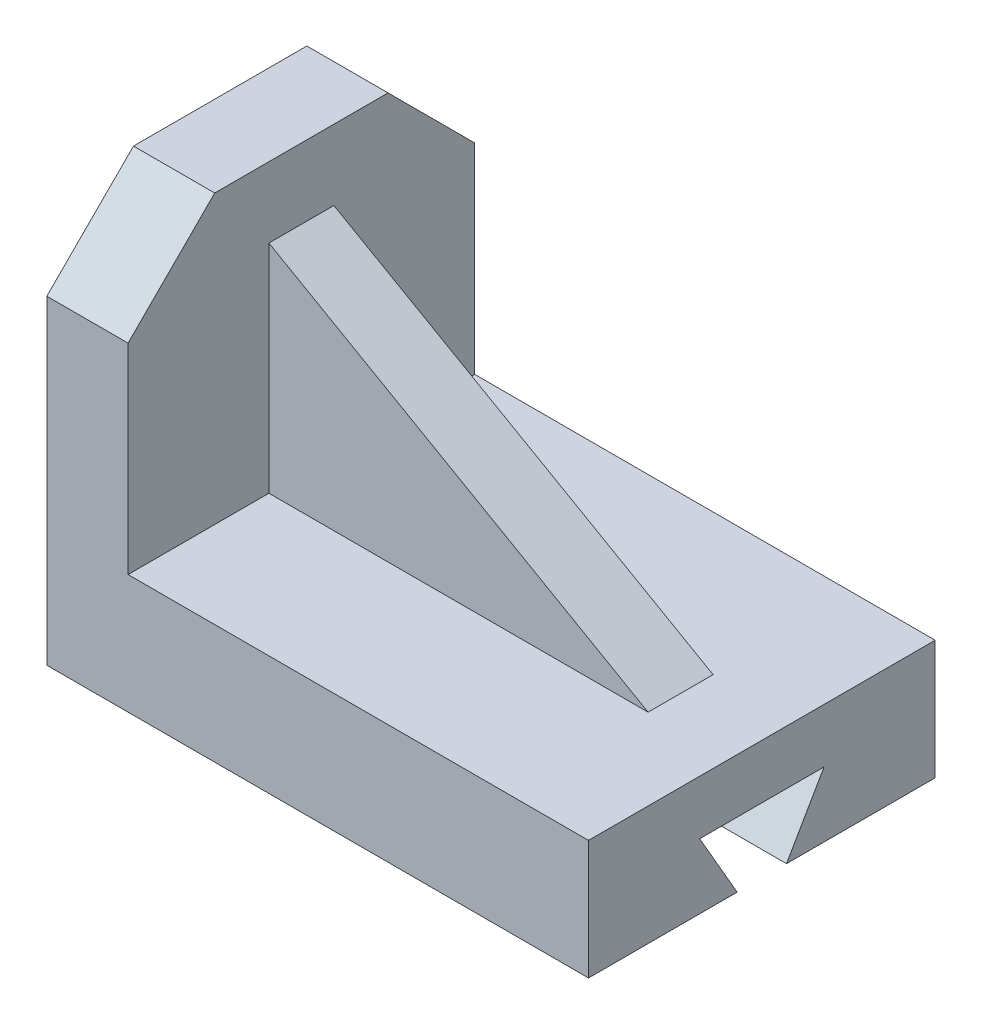
ISO-10303-21;
HEADER;
FILE_DESCRIPTION(('STEP AP214'),'2;1');
FILE_NAME('part.step','',(''),(''),'','','');
FILE_SCHEMA(('AUTOMOTIVE_DESIGN { 1 0 10303 214 1 1 1 1 }'));
ENDSEC;
DATA;
#1=APPLICATION_CONTEXT('core data for automotive mechanical design processes');
#2=APPLICATION_PROTOCOL_DEFINITION('international standard','automotive_design',2000,#1);
#3=PRODUCT_CONTEXT('',#1,'mechanical');
#4=PRODUCT('Part','Part','',(#3));
#5=PRODUCT_RELATED_PRODUCT_CATEGORY('part','',(#4));
#6=PRODUCT_DEFINITION_FORMATION('','',#4);
#7=PRODUCT_DEFINITION_CONTEXT('part definition',#1,'design');
#8=PRODUCT_DEFINITION('design','',#6,#7);
#9=PRODUCT_DEFINITION_SHAPE('','',#8);
#10=(LENGTH_UNIT() NAMED_UNIT(*) SI_UNIT(.MILLI.,.METRE.));
#11=(NAMED_UNIT(*) PLANE_ANGLE_UNIT() SI_UNIT($,.RADIAN.));
#12=(NAMED_UNIT(*) SI_UNIT($,.STERADIAN.) SOLID_ANGLE_UNIT());
#13=UNCERTAINTY_MEASURE_WITH_UNIT(LENGTH_MEASURE(1.E-05),#10,'distance_accuracy_value','');
#14=(GEOMETRIC_REPRESENTATION_CONTEXT(3) GLOBAL_UNCERTAINTY_ASSIGNED_CONTEXT((#13)) GLOBAL_UNIT_ASSIGNED_CONTEXT((#10,
#11,#12)) REPRESENTATION_CONTEXT('',''));
#15=CARTESIAN_POINT('',(0.,0.,0.));
#16=DIRECTION('',(0.,0.,1.));
#17=DIRECTION('',(1.,0.,0.));
#18=AXIS2_PLACEMENT_3D('',#15,#16,#17);
#19=CARTESIAN_POINT('',(0.,75.,-16.));
#20=DIRECTION('',(0.,0.707106781186548,-0.707106781186548));
#21=DIRECTION('',(1.,0.,0.));
#22=AXIS2_PLACEMENT_3D('',#19,#20,#21);
#23=PLANE('',#22);
#24=DIRECTION('',(-1.,0.,0.));
#25=VECTOR('',#24,1.);
#26=CARTESIAN_POINT('',(-35.,75.,-16.));
#27=LINE('',#26,#25);
#28=CARTESIAN_POINT('',(-35.,75.,-16.));
#29=VERTEX_POINT('',#28);
#30=CARTESIAN_POINT('',(-50.,75.,-16.));
#31=VERTEX_POINT('',#30);
#32=EDGE_CURVE('E297',#29,#31,#27,.T.);
#33=ORIENTED_EDGE('',*,*,#32,.F.);
#34=DIRECTION('',(0.,0.707106781186548,0.707106781186548));
#35=VECTOR('',#34,1.);
#36=CARTESIAN_POINT('',(-35.,75.,-16.));
#37=LINE('',#36,#35);
#38=CARTESIAN_POINT('',(-35.,59.,-32.));
#39=VERTEX_POINT('',#38);
#40=EDGE_CURVE('E305',#39,#29,#37,.T.);
#41=ORIENTED_EDGE('',*,*,#40,.F.);
#42=DIRECTION('',(1.,0.,0.));
#43=VECTOR('',#42,1.);
#44=CARTESIAN_POINT('',(-35.,59.,-32.));
#45=LINE('',#44,#43);
#46=CARTESIAN_POINT('',(-50.,59.,-32.));
#47=VERTEX_POINT('',#46);
#48=EDGE_CURVE('E301',#47,#39,#45,.T.);
#49=ORIENTED_EDGE('',*,*,#48,.F.);
#50=DIRECTION('',(0.,-0.707106781186548,-0.707106781186548));
#51=VECTOR('',#50,1.);
#52=CARTESIAN_POINT('',(-50.,75.,-16.));
#53=LINE('',#52,#51);
#54=EDGE_CURVE('E171',#31,#47,#53,.T.);
#55=ORIENTED_EDGE('',*,*,#54,.F.);
#56=EDGE_LOOP('',(#33,#41,#49,#55));
#57=FACE_BOUND('',#56,.T.);
#58=ADVANCED_FACE('F51',(#57),#23,.T.);
#59=CARTESIAN_POINT('',(0.,75.,16.));
#60=DIRECTION('',(0.,0.707106781186548,0.707106781186548));
#61=DIRECTION('',(-1.,0.,0.));
#62=AXIS2_PLACEMENT_3D('',#59,#60,#61);
#63=PLANE('',#62);
#64=DIRECTION('',(1.,0.,0.));
#65=VECTOR('',#64,1.);
#66=CARTESIAN_POINT('',(-50.,75.,16.));
#67=LINE('',#66,#65);
#68=CARTESIAN_POINT('',(-50.,75.,16.));
#69=VERTEX_POINT('',#68);
#70=CARTESIAN_POINT('',(-35.,75.,16.));
#71=VERTEX_POINT('',#70);
#72=EDGE_CURVE('E282',#69,#71,#67,.T.);
#73=ORIENTED_EDGE('',*,*,#72,.F.);
#74=DIRECTION('',(0.,0.707106781186548,-0.707106781186548));
#75=VECTOR('',#74,1.);
#76=CARTESIAN_POINT('',(-50.,75.,16.));
#77=LINE('',#76,#75);
#78=CARTESIAN_POINT('',(-50.,59.,32.));
#79=VERTEX_POINT('',#78);
#80=EDGE_CURVE('E290',#79,#69,#77,.T.);
#81=ORIENTED_EDGE('',*,*,#80,.F.);
#82=DIRECTION('',(-1.,0.,0.));
#83=VECTOR('',#82,1.);
#84=CARTESIAN_POINT('',(-50.,59.,32.));
#85=LINE('',#84,#83);
#86=CARTESIAN_POINT('',(-35.,59.,32.));
#87=VERTEX_POINT('',#86);
#88=EDGE_CURVE('E286',#87,#79,#85,.T.);
#89=ORIENTED_EDGE('',*,*,#88,.F.);
#90=DIRECTION('',(0.,-0.707106781186548,0.707106781186548));
#91=VECTOR('',#90,1.);
#92=CARTESIAN_POINT('',(-35.,75.,16.));
#93=LINE('',#92,#91);
#94=EDGE_CURVE('E294',#71,#87,#93,.T.);
#95=ORIENTED_EDGE('',*,*,#94,.F.);
#96=EDGE_LOOP('',(#73,#81,#89,#95));
#97=FACE_BOUND('',#96,.T.);
#98=ADVANCED_FACE('F357',(#97),#63,.T.);
#99=CARTESIAN_POINT('',(0.,0.,0.));
#100=DIRECTION('',(0.,1.,0.));
#101=DIRECTION('',(0.,0.,1.));
#102=AXIS2_PLACEMENT_3D('',#99,#100,#101);
#103=PLANE('',#102);
#104=DIRECTION('',(1.,0.,0.));
#105=VECTOR('',#104,1.);
#106=CARTESIAN_POINT('',(-50.,0.,32.));
#107=LINE('',#106,#105);
#108=CARTESIAN_POINT('',(-50.,0.,32.));
#109=VERTEX_POINT('',#108);
#110=CARTESIAN_POINT('',(50.,0.,32.));
#111=VERTEX_POINT('',#110);
#112=EDGE_CURVE('E237',#109,#111,#107,.T.);
#113=ORIENTED_EDGE('',*,*,#112,.F.);
#114=DIRECTION('',(0.,0.,1.));
#115=VECTOR('',#114,1.);
#116=CARTESIAN_POINT('',(-50.,0.,-32.));
#117=LINE('',#116,#115);
#118=CARTESIAN_POINT('',(-50.,0.,4.55175978703522));
#119=VERTEX_POINT('',#118);
#120=EDGE_CURVE('E252',#119,#109,#117,.T.);
#121=ORIENTED_EDGE('',*,*,#120,.F.);
#122=DIRECTION('',(-1.,0.,0.));
#123=VECTOR('',#122,1.);
#124=CARTESIAN_POINT('',(200.934588481236,0.,4.5517597870352));
#125=LINE('',#124,#123);
#126=CARTESIAN_POINT('',(50.,0.,4.55175978703521));
#127=VERTEX_POINT('',#126);
#128=EDGE_CURVE('E206',#127,#119,#125,.T.);
#129=ORIENTED_EDGE('',*,*,#128,.F.);
#130=DIRECTION('',(0.,0.,-1.));
#131=VECTOR('',#130,1.);
#132=CARTESIAN_POINT('',(50.,0.,-32.));
#133=LINE('',#132,#131);
#134=EDGE_CURVE('E245',#111,#127,#133,.T.);
#135=ORIENTED_EDGE('',*,*,#134,.F.);
#136=EDGE_LOOP('',(#113,#121,#129,#135));
#137=FACE_BOUND('',#136,.T.);
#138=ADVANCED_FACE('F342',(#137),#103,.F.);
#139=CARTESIAN_POINT('',(50.,22.,-32.));
#140=DIRECTION('',(-1.,0.,0.));
#141=DIRECTION('',(0.,0.,1.));
#142=AXIS2_PLACEMENT_3D('',#139,#140,#141);
#143=PLANE('',#142);
#144=CARTESIAN_POINT('',(50.,0.,-4.55175978703522));
#145=VERTEX_POINT('',#144);
#146=CARTESIAN_POINT('',(50.,0.,-32.));
#147=VERTEX_POINT('',#146);
#148=EDGE_CURVE('E231',#145,#147,#133,.T.);
#149=ORIENTED_EDGE('',*,*,#148,.T.);
#150=DIRECTION('',(0.,-1.,0.));
#151=VECTOR('',#150,1.);
#152=CARTESIAN_POINT('',(50.,22.,-32.));
#153=LINE('',#152,#151);
#154=CARTESIAN_POINT('',(50.,22.,-32.));
#155=VERTEX_POINT('',#154);
#156=EDGE_CURVE('E268',#155,#147,#153,.T.);
#157=ORIENTED_EDGE('',*,*,#156,.F.);
#158=DIRECTION('',(0.,0.,-1.));
#159=VECTOR('',#158,1.);
#160=CARTESIAN_POINT('',(50.,22.,-32.));
#161=LINE('',#160,#159);
#162=CARTESIAN_POINT('',(50.,22.,32.));
#163=VERTEX_POINT('',#162);
#164=EDGE_CURVE('E232',#163,#155,#161,.T.);
#165=ORIENTED_EDGE('',*,*,#164,.F.);
#166=DIRECTION('',(0.,-1.,0.));
#167=VECTOR('',#166,1.);
#168=CARTESIAN_POINT('',(50.,22.,32.));
#169=LINE('',#168,#167);
#170=EDGE_CURVE('E244',#163,#111,#169,.T.);
#171=ORIENTED_EDGE('',*,*,#170,.T.);
#172=ORIENTED_EDGE('',*,*,#134,.T.);
#173=DIRECTION('',(0.,-0.866025403784437,-0.500000000000004));
#174=VECTOR('',#173,1.);
#175=CARTESIAN_POINT('',(50.,0.672623735700355,4.94009928190515));
#176=LINE('',#175,#174);
#177=CARTESIAN_POINT('',(50.,12.,11.4799630173108));
#178=VERTEX_POINT('',#177);
#179=EDGE_CURVE('E218',#178,#127,#176,.T.);
#180=ORIENTED_EDGE('',*,*,#179,.F.);
#181=DIRECTION('',(0.,0.,1.));
#182=VECTOR('',#181,1.);
#183=CARTESIAN_POINT('',(50.,12.,-32.));
#184=LINE('',#183,#182);
#185=CARTESIAN_POINT('',(50.,12.,-11.4799630173108));
#186=VERTEX_POINT('',#185);
#187=EDGE_CURVE('E225',#186,#178,#184,.T.);
#188=ORIENTED_EDGE('',*,*,#187,.F.);
#189=DIRECTION('',(0.,0.866025403784436,-0.500000000000004));
#190=VECTOR('',#189,1.);
#191=CARTESIAN_POINT('',(50.,28.3854366568025,-20.9400992819054));
#192=LINE('',#191,#190);
#193=EDGE_CURVE('E228',#145,#186,#192,.T.);
#194=ORIENTED_EDGE('',*,*,#193,.F.);
#195=EDGE_LOOP('',(#149,#157,#165,#171,#172,#180,#188,#194));
#196=FACE_BOUND('',#195,.T.);
#197=ADVANCED_FACE('F347',(#196),#143,.F.);
#198=CARTESIAN_POINT('',(-50.,22.,-32.));
#199=DIRECTION('',(1.,0.,0.));
#200=DIRECTION('',(0.,0.,-1.));
#201=AXIS2_PLACEMENT_3D('',#198,#199,#200);
#202=PLANE('',#201);
#203=DIRECTION('',(0.,-0.866025403784436,0.500000000000004));
#204=VECTOR('',#203,1.);
#205=CARTESIAN_POINT('',(-50.,28.3854366568025,-20.9400992819054));
#206=LINE('',#205,#204);
#207=CARTESIAN_POINT('',(-50.,12.,-11.4799630173108));
#208=VERTEX_POINT('',#207);
#209=CARTESIAN_POINT('',(-50.,0.,-4.55175978703521));
#210=VERTEX_POINT('',#209);
#211=EDGE_CURVE('E278',#208,#210,#206,.T.);
#212=ORIENTED_EDGE('',*,*,#211,.F.);
#213=DIRECTION('',(0.,0.,-1.));
#214=VECTOR('',#213,1.);
#215=CARTESIAN_POINT('',(-50.,12.,-32.));
#216=LINE('',#215,#214);
#217=CARTESIAN_POINT('',(-50.,12.,11.4799630173108));
#218=VERTEX_POINT('',#217);
#219=EDGE_CURVE('E275',#218,#208,#216,.T.);
#220=ORIENTED_EDGE('',*,*,#219,.F.);
#221=DIRECTION('',(0.,0.866025403784437,0.500000000000004));
#222=VECTOR('',#221,1.);
#223=CARTESIAN_POINT('',(-50.,0.672623735700349,4.94009928190516));
#224=LINE('',#223,#222);
#225=EDGE_CURVE('E272',#119,#218,#224,.T.);
#226=ORIENTED_EDGE('',*,*,#225,.F.);
#227=ORIENTED_EDGE('',*,*,#120,.T.);
#228=DIRECTION('',(0.,-1.,0.));
#229=VECTOR('',#228,1.);
#230=CARTESIAN_POINT('',(-50.,22.,32.));
#231=LINE('',#230,#229);
#232=EDGE_CURVE('E261',#79,#109,#231,.T.);
#233=ORIENTED_EDGE('',*,*,#232,.F.);
#234=ORIENTED_EDGE('',*,*,#80,.T.);
#235=DIRECTION('',(0.,0.,1.));
#236=VECTOR('',#235,1.);
#237=CARTESIAN_POINT('',(-50.,75.,-32.));
#238=LINE('',#237,#236);
#239=EDGE_CURVE('E188',#31,#69,#238,.T.);
#240=ORIENTED_EDGE('',*,*,#239,.F.);
#241=ORIENTED_EDGE('',*,*,#54,.T.);
#242=DIRECTION('',(0.,-1.,0.));
#243=VECTOR('',#242,1.);
#244=CARTESIAN_POINT('',(-50.,22.,-32.));
#245=LINE('',#244,#243);
#246=CARTESIAN_POINT('',(-50.,0.,-32.));
#247=VERTEX_POINT('',#246);
#248=EDGE_CURVE('E265',#47,#247,#245,.T.);
#249=ORIENTED_EDGE('',*,*,#248,.T.);
#250=EDGE_CURVE('E253',#247,#210,#117,.T.);
#251=ORIENTED_EDGE('',*,*,#250,.T.);
#252=EDGE_LOOP('',(#212,#220,#226,#227,#233,#234,#240,#241,#249,#251));
#253=FACE_BOUND('',#252,.T.);
#254=ADVANCED_FACE('F313',(#253),#202,.F.);
#255=CARTESIAN_POINT('',(-50.,22.,-32.));
#256=DIRECTION('',(0.,0.,1.));
#257=DIRECTION('',(1.,0.,0.));
#258=AXIS2_PLACEMENT_3D('',#255,#256,#257);
#259=PLANE('',#258);
#260=ORIENTED_EDGE('',*,*,#248,.F.);
#261=ORIENTED_EDGE('',*,*,#48,.T.);
#262=DIRECTION('',(0.,-1.,0.));
#263=VECTOR('',#262,1.);
#264=CARTESIAN_POINT('',(-35.,75.,-32.));
#265=LINE('',#264,#263);
#266=CARTESIAN_POINT('',(-35.,22.,-32.));
#267=VERTEX_POINT('',#266);
#268=EDGE_CURVE('E196',#39,#267,#265,.T.);
#269=ORIENTED_EDGE('',*,*,#268,.T.);
#270=DIRECTION('',(-1.,0.,0.));
#271=VECTOR('',#270,1.);
#272=CARTESIAN_POINT('',(-50.,22.,-32.));
#273=LINE('',#272,#271);
#274=EDGE_CURVE('E236',#155,#267,#273,.T.);
#275=ORIENTED_EDGE('',*,*,#274,.F.);
#276=ORIENTED_EDGE('',*,*,#156,.T.);
#277=DIRECTION('',(-1.,0.,0.));
#278=VECTOR('',#277,1.);
#279=CARTESIAN_POINT('',(-50.,0.,-32.));
#280=LINE('',#279,#278);
#281=EDGE_CURVE('E248',#147,#247,#280,.T.);
#282=ORIENTED_EDGE('',*,*,#281,.T.);
#283=EDGE_LOOP('',(#260,#261,#269,#275,#276,#282));
#284=FACE_BOUND('',#283,.T.);
#285=ADVANCED_FACE('F319',(#284),#259,.F.);
#286=CARTESIAN_POINT('',(-50.,22.,32.));
#287=DIRECTION('',(0.,0.,-1.));
#288=DIRECTION('',(-1.,0.,0.));
#289=AXIS2_PLACEMENT_3D('',#286,#287,#288);
#290=PLANE('',#289);
#291=DIRECTION('',(0.,-1.,0.));
#292=VECTOR('',#291,1.);
#293=CARTESIAN_POINT('',(-35.,75.,32.));
#294=LINE('',#293,#292);
#295=CARTESIAN_POINT('',(-35.,22.,32.));
#296=VERTEX_POINT('',#295);
#297=EDGE_CURVE('E202',#87,#296,#294,.T.);
#298=ORIENTED_EDGE('',*,*,#297,.F.);
#299=ORIENTED_EDGE('',*,*,#88,.T.);
#300=ORIENTED_EDGE('',*,*,#232,.T.);
#301=ORIENTED_EDGE('',*,*,#112,.T.);
#302=ORIENTED_EDGE('',*,*,#170,.F.);
#303=DIRECTION('',(1.,0.,0.));
#304=VECTOR('',#303,1.);
#305=CARTESIAN_POINT('',(-50.,22.,32.));
#306=LINE('',#305,#304);
#307=EDGE_CURVE('E241',#296,#163,#306,.T.);
#308=ORIENTED_EDGE('',*,*,#307,.F.);
#309=EDGE_LOOP('',(#298,#299,#300,#301,#302,#308));
#310=FACE_BOUND('',#309,.T.);
#311=ADVANCED_FACE('F353',(#310),#290,.F.);
#312=CARTESIAN_POINT('',(0.,22.,0.));
#313=DIRECTION('',(0.,1.,0.));
#314=DIRECTION('',(0.,0.,1.));
#315=AXIS2_PLACEMENT_3D('',#312,#313,#314);
#316=PLANE('',#315);
#317=DIRECTION('',(1.,0.,0.));
#318=VECTOR('',#317,1.);
#319=CARTESIAN_POINT('',(0.,22.,6.));
#320=LINE('',#319,#318);
#321=CARTESIAN_POINT('',(-35.,22.,6.));
#322=VERTEX_POINT('',#321);
#323=CARTESIAN_POINT('',(35.,22.,6.));
#324=VERTEX_POINT('',#323);
#325=EDGE_CURVE('E182',#322,#324,#320,.T.);
#326=ORIENTED_EDGE('',*,*,#325,.F.);
#327=DIRECTION('',(0.,0.,-1.));
#328=VECTOR('',#327,1.);
#329=CARTESIAN_POINT('',(-35.,22.,-32.));
#330=LINE('',#329,#328);
#331=EDGE_CURVE('E192',#296,#322,#330,.T.);
#332=ORIENTED_EDGE('',*,*,#331,.F.);
#333=ORIENTED_EDGE('',*,*,#307,.T.);
#334=ORIENTED_EDGE('',*,*,#164,.T.);
#335=ORIENTED_EDGE('',*,*,#274,.T.);
#336=CARTESIAN_POINT('',(-35.,22.,-6.));
#337=VERTEX_POINT('',#336);
#338=EDGE_CURVE('E187',#337,#267,#330,.T.);
#339=ORIENTED_EDGE('',*,*,#338,.F.);
#340=DIRECTION('',(1.,0.,0.));
#341=VECTOR('',#340,1.);
#342=CARTESIAN_POINT('',(0.,22.,-6.));
#343=LINE('',#342,#341);
#344=CARTESIAN_POINT('',(35.,22.,-6.));
#345=VERTEX_POINT('',#344);
#346=EDGE_CURVE('E72',#337,#345,#343,.T.);
#347=ORIENTED_EDGE('',*,*,#346,.T.);
#348=DIRECTION('',(0.,0.,1.));
#349=VECTOR('',#348,1.);
#350=CARTESIAN_POINT('',(35.,22.,0.));
#351=LINE('',#350,#349);
#352=EDGE_CURVE('E67',#324,#345,#351,.F.);
#353=ORIENTED_EDGE('',*,*,#352,.F.);
#354=EDGE_LOOP('',(#326,#332,#333,#334,#335,#339,#347,#353));
#355=FACE_BOUND('',#354,.T.);
#356=ADVANCED_FACE('F361',(#355),#316,.T.);
#357=DIRECTION('',(-1.,0.,0.));
#358=VECTOR('',#357,1.);
#359=CARTESIAN_POINT('',(200.934588481236,0.,-4.55175978703524));
#360=LINE('',#359,#358);
#361=EDGE_CURVE('E214',#145,#210,#360,.T.);
#362=ORIENTED_EDGE('',*,*,#361,.T.);
#363=ORIENTED_EDGE('',*,*,#250,.F.);
#364=ORIENTED_EDGE('',*,*,#281,.F.);
#365=ORIENTED_EDGE('',*,*,#148,.F.);
#366=EDGE_LOOP('',(#362,#363,#364,#365));
#367=FACE_BOUND('',#366,.T.);
#368=ADVANCED_FACE('F325',(#367),#103,.F.);
#369=CARTESIAN_POINT('',(200.934588481236,12.,-11.4799630173108));
#370=DIRECTION('',(0.,0.500000000000004,0.866025403784436));
#371=DIRECTION('',(0.,-0.866025403784436,0.500000000000004));
#372=AXIS2_PLACEMENT_3D('',#369,#370,#371);
#373=PLANE('',#372);
#374=ORIENTED_EDGE('',*,*,#193,.T.);
#375=DIRECTION('',(-1.,0.,0.));
#376=VECTOR('',#375,1.);
#377=CARTESIAN_POINT('',(200.934588481236,12.,-11.4799630173108));
#378=LINE('',#377,#376);
#379=EDGE_CURVE('E210',#186,#208,#378,.T.);
#380=ORIENTED_EDGE('',*,*,#379,.T.);
#381=ORIENTED_EDGE('',*,*,#211,.T.);
#382=ORIENTED_EDGE('',*,*,#361,.F.);
#383=EDGE_LOOP('',(#374,#380,#381,#382));
#384=FACE_BOUND('',#383,.T.);
#385=ADVANCED_FACE('F329',(#384),#373,.T.);
#386=CARTESIAN_POINT('',(200.934588481236,12.,11.4799630173108));
#387=DIRECTION('',(0.,-1.,0.));
#388=DIRECTION('',(0.,0.,-1.));
#389=AXIS2_PLACEMENT_3D('',#386,#387,#388);
#390=PLANE('',#389);
#391=ORIENTED_EDGE('',*,*,#219,.T.);
#392=ORIENTED_EDGE('',*,*,#379,.F.);
#393=ORIENTED_EDGE('',*,*,#187,.T.);
#394=DIRECTION('',(-1.,0.,0.));
#395=VECTOR('',#394,1.);
#396=CARTESIAN_POINT('',(200.934588481236,12.,11.4799630173108));
#397=LINE('',#396,#395);
#398=EDGE_CURVE('E205',#178,#218,#397,.T.);
#399=ORIENTED_EDGE('',*,*,#398,.T.);
#400=EDGE_LOOP('',(#391,#392,#393,#399));
#401=FACE_BOUND('',#400,.T.);
#402=ADVANCED_FACE('F333',(#401),#390,.T.);
#403=CARTESIAN_POINT('',(200.934588481236,12.,11.4799630173108));
#404=DIRECTION('',(0.,0.500000000000004,-0.866025403784436));
#405=DIRECTION('',(0.,0.866025403784437,0.500000000000004));
#406=AXIS2_PLACEMENT_3D('',#403,#404,#405);
#407=PLANE('',#406);
#408=ORIENTED_EDGE('',*,*,#179,.T.);
#409=ORIENTED_EDGE('',*,*,#128,.T.);
#410=ORIENTED_EDGE('',*,*,#225,.T.);
#411=ORIENTED_EDGE('',*,*,#398,.F.);
#412=EDGE_LOOP('',(#408,#409,#410,#411));
#413=FACE_BOUND('',#412,.T.);
#414=ADVANCED_FACE('F345',(#413),#407,.T.);
#415=CARTESIAN_POINT('',(-35.,75.,-32.));
#416=DIRECTION('',(-1.,0.,0.));
#417=DIRECTION('',(0.,0.,1.));
#418=AXIS2_PLACEMENT_3D('',#415,#416,#417);
#419=PLANE('',#418);
#420=ORIENTED_EDGE('',*,*,#331,.T.);
#421=DIRECTION('',(0.,1.,0.));
#422=VECTOR('',#421,1.);
#423=CARTESIAN_POINT('',(-35.,75.,6.));
#424=LINE('',#423,#422);
#425=CARTESIAN_POINT('',(-35.,62.,6.));
#426=VERTEX_POINT('',#425);
#427=EDGE_CURVE('E13',#322,#426,#424,.T.);
#428=ORIENTED_EDGE('',*,*,#427,.T.);
#429=DIRECTION('',(0.,0.,1.));
#430=VECTOR('',#429,1.);
#431=CARTESIAN_POINT('',(-35.,62.,-32.));
#432=LINE('',#431,#430);
#433=CARTESIAN_POINT('',(-35.,62.,-6.));
#434=VERTEX_POINT('',#433);
#435=EDGE_CURVE('E60',#426,#434,#432,.F.);
#436=ORIENTED_EDGE('',*,*,#435,.T.);
#437=DIRECTION('',(0.,1.,0.));
#438=VECTOR('',#437,1.);
#439=CARTESIAN_POINT('',(-35.,75.,-6.));
#440=LINE('',#439,#438);
#441=EDGE_CURVE('E159',#337,#434,#440,.T.);
#442=ORIENTED_EDGE('',*,*,#441,.F.);
#443=ORIENTED_EDGE('',*,*,#338,.T.);
#444=ORIENTED_EDGE('',*,*,#268,.F.);
#445=ORIENTED_EDGE('',*,*,#40,.T.);
#446=DIRECTION('',(0.,0.,-1.));
#447=VECTOR('',#446,1.);
#448=CARTESIAN_POINT('',(-35.,75.,-32.));
#449=LINE('',#448,#447);
#450=EDGE_CURVE('E191',#71,#29,#449,.T.);
#451=ORIENTED_EDGE('',*,*,#450,.F.);
#452=ORIENTED_EDGE('',*,*,#94,.T.);
#453=ORIENTED_EDGE('',*,*,#297,.T.);
#454=EDGE_LOOP('',(#420,#428,#436,#442,#443,#444,#445,#451,#452,#453));
#455=FACE_BOUND('',#454,.T.);
#456=ADVANCED_FACE('F158',(#455),#419,.F.);
#457=CARTESIAN_POINT('',(0.,75.,0.));
#458=DIRECTION('',(0.,1.,0.));
#459=DIRECTION('',(0.,0.,1.));
#460=AXIS2_PLACEMENT_3D('',#457,#458,#459);
#461=PLANE('',#460);
#462=ORIENTED_EDGE('',*,*,#450,.T.);
#463=ORIENTED_EDGE('',*,*,#32,.T.);
#464=ORIENTED_EDGE('',*,*,#239,.T.);
#465=ORIENTED_EDGE('',*,*,#72,.T.);
#466=EDGE_LOOP('',(#462,#463,#464,#465));
#467=FACE_BOUND('',#466,.T.);
#468=ADVANCED_FACE('F360',(#467),#461,.T.);
#469=CARTESIAN_POINT('',(-35.,62.,0.));
#470=DIRECTION('',(-0.496138938356834,-0.868243142124459,0.));
#471=DIRECTION('',(0.868243142124459,-0.496138938356834,0.));
#472=AXIS2_PLACEMENT_3D('',#469,#470,#471);
#473=PLANE('',#472);
#474=DIRECTION('',(0.868243142124459,-0.496138938356834,0.));
#475=VECTOR('',#474,1.);
#476=CARTESIAN_POINT('',(-35.,62.,6.));
#477=LINE('',#476,#475);
#478=EDGE_CURVE('E175',#426,#324,#477,.T.);
#479=ORIENTED_EDGE('',*,*,#478,.T.);
#480=ORIENTED_EDGE('',*,*,#352,.T.);
#481=DIRECTION('',(0.868243142124459,-0.496138938356834,0.));
#482=VECTOR('',#481,1.);
#483=CARTESIAN_POINT('',(-35.,62.,-6.));
#484=LINE('',#483,#482);
#485=EDGE_CURVE('E169',#434,#345,#484,.T.);
#486=ORIENTED_EDGE('',*,*,#485,.F.);
#487=ORIENTED_EDGE('',*,*,#435,.F.);
#488=EDGE_LOOP('',(#479,#480,#486,#487));
#489=FACE_BOUND('',#488,.T.);
#490=ADVANCED_FACE('F173',(#489),#473,.F.);
#491=CARTESIAN_POINT('',(0.,37.5,6.));
#492=DIRECTION('',(0.,0.,1.));
#493=DIRECTION('',(1.,0.,0.));
#494=AXIS2_PLACEMENT_3D('',#491,#492,#493);
#495=PLANE('',#494);
#496=ORIENTED_EDGE('',*,*,#427,.F.);
#497=ORIENTED_EDGE('',*,*,#325,.T.);
#498=ORIENTED_EDGE('',*,*,#478,.F.);
#499=EDGE_LOOP('',(#496,#497,#498));
#500=FACE_BOUND('',#499,.T.);
#501=ADVANCED_FACE('F366',(#500),#495,.T.);
#502=CARTESIAN_POINT('',(0.,37.5,-6.));
#503=DIRECTION('',(0.,0.,1.));
#504=DIRECTION('',(1.,0.,0.));
#505=AXIS2_PLACEMENT_3D('',#502,#503,#504);
#506=PLANE('',#505);
#507=ORIENTED_EDGE('',*,*,#346,.F.);
#508=ORIENTED_EDGE('',*,*,#441,.T.);
#509=ORIENTED_EDGE('',*,*,#485,.T.);
#510=EDGE_LOOP('',(#507,#508,#509));
#511=FACE_BOUND('',#510,.T.);
#512=ADVANCED_FACE('F168',(#511),#506,.F.);
#513=CLOSED_SHELL('',(#58,#98,#138,#197,#254,#285,#311,#356,#368,#385,#402,#414,#456,#468,#490,
#501,#512));
#514=MANIFOLD_SOLID_BREP('B2',#513);
#515=ADVANCED_BREP_SHAPE_REPRESENTATION('',(#18,#514),#14);
#516=SHAPE_DEFINITION_REPRESENTATION(#9,#515);
ENDSEC;
END-ISO-10303-21;
